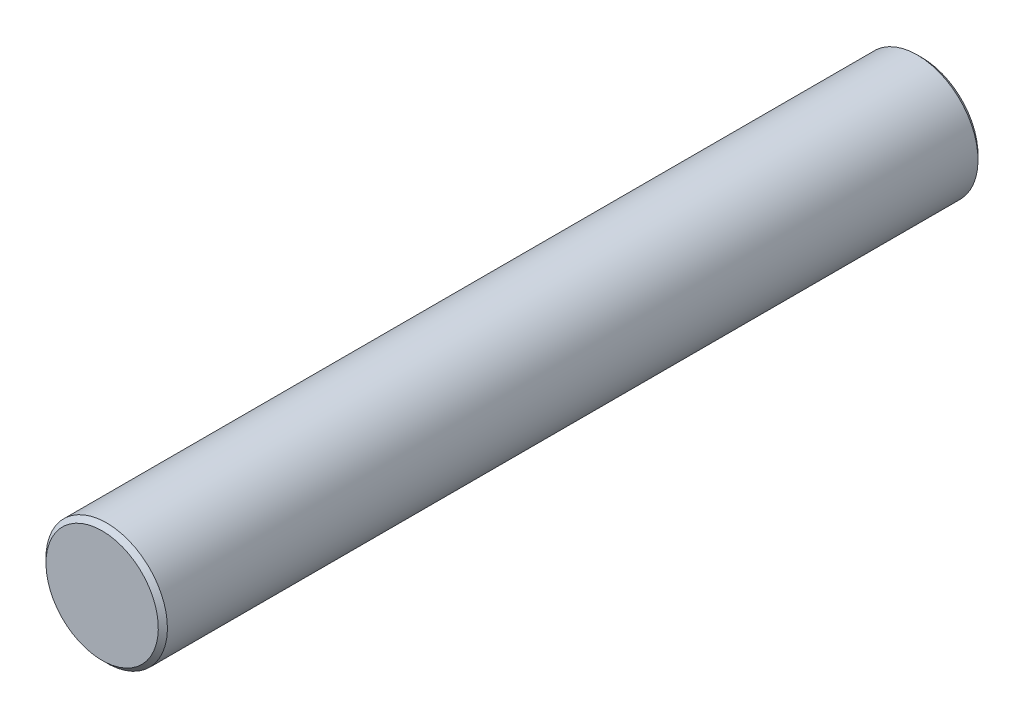
ISO-10303-21;
HEADER;
FILE_DESCRIPTION(('STEP AP214'),'2;1');
FILE_NAME('part.step','',(''),(''),'','','');
FILE_SCHEMA(('AUTOMOTIVE_DESIGN { 1 0 10303 214 1 1 1 1 }'));
ENDSEC;
DATA;
#1=APPLICATION_CONTEXT('core data for automotive mechanical design processes');
#2=APPLICATION_PROTOCOL_DEFINITION('international standard','automotive_design',2000,#1);
#3=PRODUCT_CONTEXT('',#1,'mechanical');
#4=PRODUCT('Part','Part','',(#3));
#5=PRODUCT_RELATED_PRODUCT_CATEGORY('part','',(#4));
#6=PRODUCT_DEFINITION_FORMATION('','',#4);
#7=PRODUCT_DEFINITION_CONTEXT('part definition',#1,'design');
#8=PRODUCT_DEFINITION('design','',#6,#7);
#9=PRODUCT_DEFINITION_SHAPE('','',#8);
#10=(LENGTH_UNIT() NAMED_UNIT(*) SI_UNIT(.MILLI.,.METRE.));
#11=(NAMED_UNIT(*) PLANE_ANGLE_UNIT() SI_UNIT($,.RADIAN.));
#12=(NAMED_UNIT(*) SI_UNIT($,.STERADIAN.) SOLID_ANGLE_UNIT());
#13=UNCERTAINTY_MEASURE_WITH_UNIT(LENGTH_MEASURE(1.E-05),#10,'distance_accuracy_value','');
#14=(GEOMETRIC_REPRESENTATION_CONTEXT(3) GLOBAL_UNCERTAINTY_ASSIGNED_CONTEXT((#13)) GLOBAL_UNIT_ASSIGNED_CONTEXT((#10,
#11,#12)) REPRESENTATION_CONTEXT('',''));
#15=CARTESIAN_POINT('',(0.,0.,0.));
#16=DIRECTION('',(0.,0.,1.));
#17=DIRECTION('',(1.,0.,0.));
#18=AXIS2_PLACEMENT_3D('',#15,#16,#17);
#19=CARTESIAN_POINT('',(0.,9.25,0.));
#20=DIRECTION('',(0.,0.,-1.));
#21=DIRECTION('',(0.,1.,0.));
#22=AXIS2_PLACEMENT_3D('',#19,#20,#21);
#23=PLANE('',#22);
#24=CARTESIAN_POINT('',(0.,0.,0.));
#25=DIRECTION('',(0.,0.,-1.));
#26=DIRECTION('',(0.,1.,0.));
#27=AXIS2_PLACEMENT_3D('',#24,#25,#26);
#28=CIRCLE('',#27,18.5);
#29=CARTESIAN_POINT('',(0.,18.5,0.));
#30=VERTEX_POINT('',#29);
#31=EDGE_CURVE('E9',#30,#30,#28,.T.);
#32=ORIENTED_EDGE('',*,*,#31,.T.);
#33=EDGE_LOOP('',(#32));
#34=FACE_BOUND('',#33,.T.);
#35=CARTESIAN_POINT('',(0.,0.,0.));
#36=DIRECTION('',(0.,0.,1.));
#37=DIRECTION('',(-1.,0.,0.));
#38=AXIS2_PLACEMENT_3D('',#35,#36,#37);
#39=CIRCLE('',#38,6.);
#40=CARTESIAN_POINT('',(-6.,0.,0.));
#41=VERTEX_POINT('',#40);
#42=EDGE_CURVE('E52',#41,#41,#39,.T.);
#43=ORIENTED_EDGE('',*,*,#42,.T.);
#44=EDGE_LOOP('',(#43));
#45=FACE_BOUND('',#44,.T.);
#46=ADVANCED_FACE('F15',(#34,#45),#23,.T.);
#47=CARTESIAN_POINT('',(0.,0.,0.75));
#48=DIRECTION('',(0.,0.,1.));
#49=DIRECTION('',(0.,1.,0.));
#50=AXIS2_PLACEMENT_3D('',#47,#48,#49);
#51=CONICAL_SURFACE('',#50,19.25,0.785398163397448);
#52=CARTESIAN_POINT('',(0.,0.,1.5));
#53=DIRECTION('',(0.,0.,-1.));
#54=DIRECTION('',(0.,1.,0.));
#55=AXIS2_PLACEMENT_3D('',#52,#53,#54);
#56=CIRCLE('',#55,20.);
#57=CARTESIAN_POINT('',(0.,20.,1.5));
#58=VERTEX_POINT('',#57);
#59=EDGE_CURVE('E25',#58,#58,#56,.T.);
#60=ORIENTED_EDGE('',*,*,#59,.T.);
#61=EDGE_LOOP('',(#60));
#62=FACE_BOUND('',#61,.T.);
#63=ORIENTED_EDGE('',*,*,#31,.F.);
#64=EDGE_LOOP('',(#63));
#65=FACE_BOUND('',#64,.T.);
#66=ADVANCED_FACE('F121',(#62,#65),#51,.T.);
#67=CARTESIAN_POINT('',(0.,0.,135.));
#68=DIRECTION('',(0.,0.,1.));
#69=DIRECTION('',(0.,1.,0.));
#70=AXIS2_PLACEMENT_3D('',#67,#68,#69);
#71=CYLINDRICAL_SURFACE('',#70,20.);
#72=CARTESIAN_POINT('',(0.,0.,268.5));
#73=DIRECTION('',(0.,0.,-1.));
#74=DIRECTION('',(0.,1.,0.));
#75=AXIS2_PLACEMENT_3D('',#72,#73,#74);
#76=CIRCLE('',#75,20.);
#77=CARTESIAN_POINT('',(0.,20.,268.5));
#78=VERTEX_POINT('',#77);
#79=EDGE_CURVE('E19',#78,#78,#76,.T.);
#80=ORIENTED_EDGE('',*,*,#79,.T.);
#81=EDGE_LOOP('',(#80));
#82=FACE_BOUND('',#81,.T.);
#83=ORIENTED_EDGE('',*,*,#59,.F.);
#84=EDGE_LOOP('',(#83));
#85=FACE_BOUND('',#84,.T.);
#86=CARTESIAN_POINT('',(0.,0.,6.5));
#87=DIRECTION('',(0.,0.,-1.));
#88=DIRECTION('',(0.,1.,0.));
#89=AXIS2_PLACEMENT_3D('',#86,#87,#88);
#90=CIRCLE('',#89,20.);
#91=CARTESIAN_POINT('',(10.5356537528527,-17.,6.5));
#92=VERTEX_POINT('',#91);
#93=CARTESIAN_POINT('',(-10.5356537528527,-17.,6.5));
#94=VERTEX_POINT('',#93);
#95=EDGE_CURVE('E69',#92,#94,#90,.T.);
#96=ORIENTED_EDGE('',*,*,#95,.T.);
#97=DIRECTION('',(0.,0.,1.));
#98=VECTOR('',#97,1.);
#99=CARTESIAN_POINT('',(-10.5356537528527,-17.,8.25));
#100=LINE('',#99,#98);
#101=CARTESIAN_POINT('',(-10.5356537528527,-17.,10.));
#102=VERTEX_POINT('',#101);
#103=EDGE_CURVE('E62',#94,#102,#100,.T.);
#104=ORIENTED_EDGE('',*,*,#103,.T.);
#105=CARTESIAN_POINT('',(0.,0.,10.));
#106=DIRECTION('',(0.,0.,1.));
#107=DIRECTION('',(0.,1.,0.));
#108=AXIS2_PLACEMENT_3D('',#105,#106,#107);
#109=CIRCLE('',#108,20.);
#110=CARTESIAN_POINT('',(10.5356537528527,-17.,10.));
#111=VERTEX_POINT('',#110);
#112=EDGE_CURVE('E75',#102,#111,#109,.T.);
#113=ORIENTED_EDGE('',*,*,#112,.T.);
#114=DIRECTION('',(0.,0.,-1.));
#115=VECTOR('',#114,1.);
#116=CARTESIAN_POINT('',(10.5356537528527,-17.,8.25));
#117=LINE('',#116,#115);
#118=EDGE_CURVE('E60',#111,#92,#117,.T.);
#119=ORIENTED_EDGE('',*,*,#118,.T.);
#120=EDGE_LOOP('',(#96,#104,#113,#119));
#121=FACE_BOUND('',#120,.T.);
#122=ADVANCED_FACE('F17',(#82,#85,#121),#71,.T.);
#123=CARTESIAN_POINT('',(0.,0.,269.25));
#124=DIRECTION('',(0.,0.,-1.));
#125=DIRECTION('',(0.,1.,0.));
#126=AXIS2_PLACEMENT_3D('',#123,#124,#125);
#127=CONICAL_SURFACE('',#126,19.25,0.785398163397448);
#128=CARTESIAN_POINT('',(0.,0.,270.));
#129=DIRECTION('',(0.,0.,-1.));
#130=DIRECTION('',(0.,1.,0.));
#131=AXIS2_PLACEMENT_3D('',#128,#129,#130);
#132=CIRCLE('',#131,18.5);
#133=CARTESIAN_POINT('',(0.,18.5,270.));
#134=VERTEX_POINT('',#133);
#135=EDGE_CURVE('E44',#134,#134,#132,.T.);
#136=ORIENTED_EDGE('',*,*,#135,.T.);
#137=EDGE_LOOP('',(#136));
#138=FACE_BOUND('',#137,.T.);
#139=ORIENTED_EDGE('',*,*,#79,.F.);
#140=EDGE_LOOP('',(#139));
#141=FACE_BOUND('',#140,.T.);
#142=ADVANCED_FACE('F116',(#138,#141),#127,.T.);
#143=CARTESIAN_POINT('',(0.,9.25,270.));
#144=DIRECTION('',(0.,0.,1.));
#145=DIRECTION('',(0.,-1.,0.));
#146=AXIS2_PLACEMENT_3D('',#143,#144,#145);
#147=PLANE('',#146);
#148=ORIENTED_EDGE('',*,*,#135,.F.);
#149=EDGE_LOOP('',(#148));
#150=FACE_BOUND('',#149,.T.);
#151=ADVANCED_FACE('F110',(#150),#147,.T.);
#152=CARTESIAN_POINT('',(0.,0.,26.4586213285198));
#153=DIRECTION('',(0.,0.,-1.));
#154=DIRECTION('',(-1.,0.,0.));
#155=AXIS2_PLACEMENT_3D('',#152,#153,#154);
#156=CONICAL_SURFACE('',#155,2.52640625,1.0471975511966);
#157=CARTESIAN_POINT('',(0.,0.,25.));
#158=DIRECTION('',(0.,0.,1.));
#159=DIRECTION('',(-1.,0.,0.));
#160=AXIS2_PLACEMENT_3D('',#157,#158,#159);
#161=CIRCLE('',#160,5.0528125);
#162=CARTESIAN_POINT('',(-5.0528125,0.,25.));
#163=VERTEX_POINT('',#162);
#164=EDGE_CURVE('E51',#163,#163,#161,.T.);
#165=ORIENTED_EDGE('',*,*,#164,.F.);
#166=EDGE_LOOP('',(#165));
#167=FACE_BOUND('',#166,.T.);
#168=CARTESIAN_POINT('',(0.,0.,27.9172426570397));
#169=VERTEX_POINT('',#168);
#170=VERTEX_LOOP('',#169);
#171=FACE_BOUND('',#170,.T.);
#172=ADVANCED_FACE('F104',(#167,#171),#156,.F.);
#173=CARTESIAN_POINT('',(0.,0.,12.97359375));
#174=DIRECTION('',(0.,0.,-1.));
#175=DIRECTION('',(-1.,0.,0.));
#176=AXIS2_PLACEMENT_3D('',#173,#174,#175);
#177=CYLINDRICAL_SURFACE('',#176,5.0528125);
#178=CARTESIAN_POINT('',(0.,0.,0.9471875));
#179=DIRECTION('',(0.,0.,1.));
#180=DIRECTION('',(-1.,0.,0.));
#181=AXIS2_PLACEMENT_3D('',#178,#179,#180);
#182=CIRCLE('',#181,5.0528125);
#183=CARTESIAN_POINT('',(-5.0528125,0.,0.9471875));
#184=VERTEX_POINT('',#183);
#185=EDGE_CURVE('E57',#184,#184,#182,.T.);
#186=ORIENTED_EDGE('',*,*,#185,.F.);
#187=EDGE_LOOP('',(#186));
#188=FACE_BOUND('',#187,.T.);
#189=ORIENTED_EDGE('',*,*,#164,.T.);
#190=EDGE_LOOP('',(#189));
#191=FACE_BOUND('',#190,.T.);
#192=ADVANCED_FACE('F101',(#188,#191),#177,.F.);
#193=CARTESIAN_POINT('',(0.,0.,0.47359375));
#194=DIRECTION('',(0.,0.,-1.));
#195=DIRECTION('',(-1.,0.,0.));
#196=AXIS2_PLACEMENT_3D('',#193,#194,#195);
#197=CONICAL_SURFACE('',#196,5.52640625,0.785398163397448);
#198=ORIENTED_EDGE('',*,*,#42,.F.);
#199=EDGE_LOOP('',(#198));
#200=FACE_BOUND('',#199,.T.);
#201=ORIENTED_EDGE('',*,*,#185,.T.);
#202=EDGE_LOOP('',(#201));
#203=FACE_BOUND('',#202,.T.);
#204=ADVANCED_FACE('F99',(#200,#203),#197,.F.);
#205=CARTESIAN_POINT('',(0.,-17.,8.25));
#206=DIRECTION('',(0.,-1.,0.));
#207=DIRECTION('',(0.,0.,-1.));
#208=AXIS2_PLACEMENT_3D('',#205,#206,#207);
#209=PLANE('',#208);
#210=ORIENTED_EDGE('',*,*,#103,.F.);
#211=DIRECTION('',(1.,0.,0.));
#212=VECTOR('',#211,1.);
#213=CARTESIAN_POINT('',(0.,-17.,6.5));
#214=LINE('',#213,#212);
#215=EDGE_CURVE('E66',#94,#92,#214,.T.);
#216=ORIENTED_EDGE('',*,*,#215,.T.);
#217=ORIENTED_EDGE('',*,*,#118,.F.);
#218=DIRECTION('',(-1.,0.,0.));
#219=VECTOR('',#218,1.);
#220=CARTESIAN_POINT('',(0.,-17.,10.));
#221=LINE('',#220,#219);
#222=EDGE_CURVE('E72',#111,#102,#221,.T.);
#223=ORIENTED_EDGE('',*,*,#222,.T.);
#224=EDGE_LOOP('',(#210,#216,#217,#223));
#225=FACE_BOUND('',#224,.T.);
#226=ADVANCED_FACE('F131',(#225),#209,.T.);
#227=CARTESIAN_POINT('',(0.,-19.5,6.5));
#228=DIRECTION('',(0.,0.,1.));
#229=DIRECTION('',(1.,0.,0.));
#230=AXIS2_PLACEMENT_3D('',#227,#228,#229);
#231=PLANE('',#230);
#232=ORIENTED_EDGE('',*,*,#95,.F.);
#233=ORIENTED_EDGE('',*,*,#215,.F.);
#234=EDGE_LOOP('',(#232,#233));
#235=FACE_BOUND('',#234,.T.);
#236=ADVANCED_FACE('F135',(#235),#231,.T.);
#237=CARTESIAN_POINT('',(0.,-19.5,10.));
#238=DIRECTION('',(0.,0.,1.));
#239=DIRECTION('',(1.,0.,0.));
#240=AXIS2_PLACEMENT_3D('',#237,#238,#239);
#241=PLANE('',#240);
#242=ORIENTED_EDGE('',*,*,#112,.F.);
#243=ORIENTED_EDGE('',*,*,#222,.F.);
#244=EDGE_LOOP('',(#242,#243));
#245=FACE_BOUND('',#244,.T.);
#246=ADVANCED_FACE('F87',(#245),#241,.F.);
#247=CLOSED_SHELL('',(#46,#66,#122,#142,#151,#172,#192,#204,#226,#236,#246));
#248=MANIFOLD_SOLID_BREP('B1',#247);
#249=ADVANCED_BREP_SHAPE_REPRESENTATION('',(#18,#248),#14);
#250=SHAPE_DEFINITION_REPRESENTATION(#9,#249);
ENDSEC;
END-ISO-10303-21;
